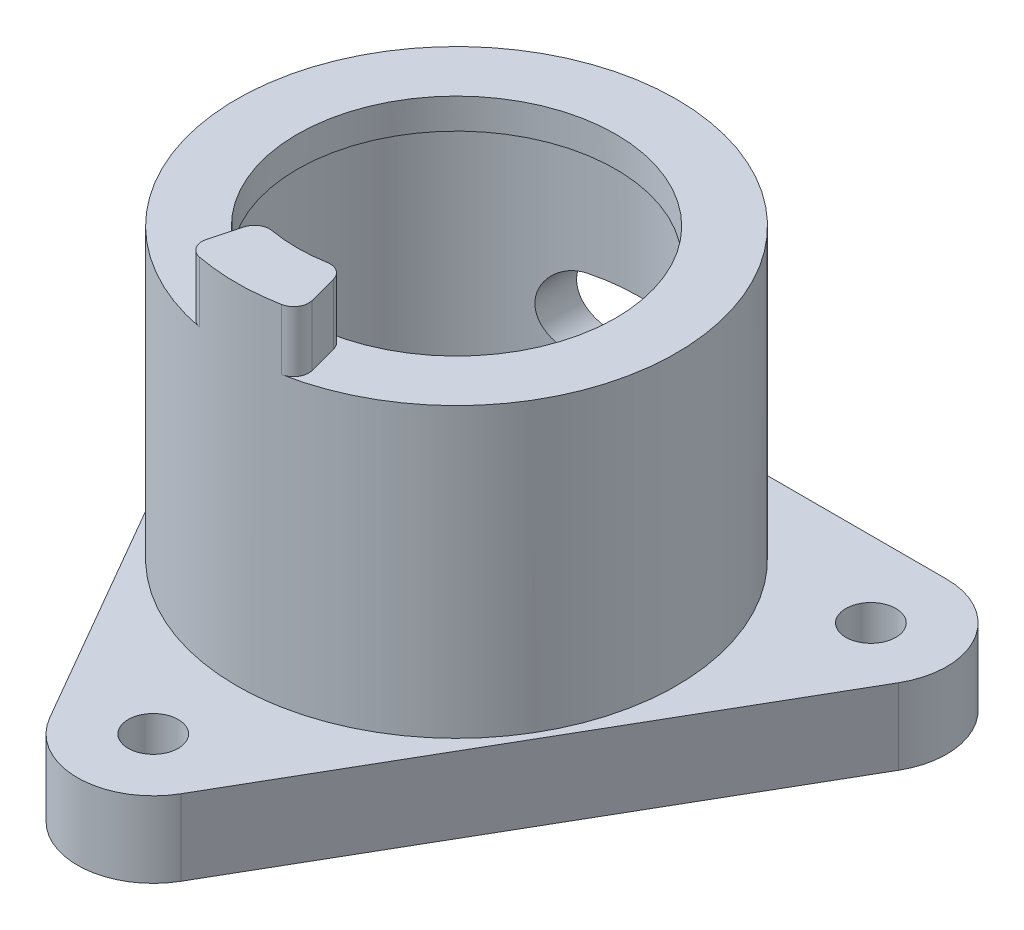
ISO-10303-21;
HEADER;
FILE_DESCRIPTION(('STEP AP214'),'2;1');
FILE_NAME('part.step','',(''),(''),'','','');
FILE_SCHEMA(('AUTOMOTIVE_DESIGN { 1 0 10303 214 1 1 1 1 }'));
ENDSEC;
DATA;
#1=APPLICATION_CONTEXT('core data for automotive mechanical design processes');
#2=APPLICATION_PROTOCOL_DEFINITION('international standard','automotive_design',2000,#1);
#3=PRODUCT_CONTEXT('',#1,'mechanical');
#4=PRODUCT('Part','Part','',(#3));
#5=PRODUCT_RELATED_PRODUCT_CATEGORY('part','',(#4));
#6=PRODUCT_DEFINITION_FORMATION('','',#4);
#7=PRODUCT_DEFINITION_CONTEXT('part definition',#1,'design');
#8=PRODUCT_DEFINITION('design','',#6,#7);
#9=PRODUCT_DEFINITION_SHAPE('','',#8);
#10=(LENGTH_UNIT() NAMED_UNIT(*) SI_UNIT(.MILLI.,.METRE.));
#11=(NAMED_UNIT(*) PLANE_ANGLE_UNIT() SI_UNIT($,.RADIAN.));
#12=(NAMED_UNIT(*) SI_UNIT($,.STERADIAN.) SOLID_ANGLE_UNIT());
#13=UNCERTAINTY_MEASURE_WITH_UNIT(LENGTH_MEASURE(1.E-05),#10,'distance_accuracy_value','');
#14=(GEOMETRIC_REPRESENTATION_CONTEXT(3) GLOBAL_UNCERTAINTY_ASSIGNED_CONTEXT((#13)) GLOBAL_UNIT_ASSIGNED_CONTEXT((#10,
#11,#12)) REPRESENTATION_CONTEXT('',''));
#15=CARTESIAN_POINT('',(0.,0.,0.));
#16=DIRECTION('',(0.,0.,1.));
#17=DIRECTION('',(1.,0.,0.));
#18=AXIS2_PLACEMENT_3D('',#15,#16,#17);
#19=CARTESIAN_POINT('',(17.3205080756888,5.,-9.99999999999998));
#20=DIRECTION('',(0.,1.,0.));
#21=DIRECTION('',(0.,0.,1.));
#22=AXIS2_PLACEMENT_3D('',#19,#20,#21);
#23=PLANE('',#22);
#24=CARTESIAN_POINT('',(0.,5.,20.));
#25=DIRECTION('',(0.,1.,0.));
#26=DIRECTION('',(0.,0.,1.));
#27=AXIS2_PLACEMENT_3D('',#24,#25,#26);
#28=CIRCLE('',#27,1.65);
#29=CARTESIAN_POINT('',(0.,5.,21.65));
#30=VERTEX_POINT('',#29);
#31=EDGE_CURVE('E287',#30,#30,#28,.T.);
#32=ORIENTED_EDGE('',*,*,#31,.F.);
#33=EDGE_LOOP('',(#32));
#34=FACE_BOUND('',#33,.T.);
#35=CARTESIAN_POINT('',(17.3205080756888,5.,-10.));
#36=DIRECTION('',(0.,1.,0.));
#37=DIRECTION('',(0.,0.,1.));
#38=AXIS2_PLACEMENT_3D('',#35,#36,#37);
#39=CIRCLE('',#38,1.65);
#40=CARTESIAN_POINT('',(17.3205080756888,5.,-8.35000000000001));
#41=VERTEX_POINT('',#40);
#42=EDGE_CURVE('E291',#41,#41,#39,.T.);
#43=ORIENTED_EDGE('',*,*,#42,.F.);
#44=EDGE_LOOP('',(#43));
#45=FACE_BOUND('',#44,.T.);
#46=CARTESIAN_POINT('',(-17.3205080756888,5.,-9.99999999999999));
#47=DIRECTION('',(0.,1.,0.));
#48=DIRECTION('',(0.,0.,1.));
#49=AXIS2_PLACEMENT_3D('',#46,#47,#48);
#50=CIRCLE('',#49,1.65);
#51=CARTESIAN_POINT('',(-17.3205080756888,5.,-8.34999999999999));
#52=VERTEX_POINT('',#51);
#53=EDGE_CURVE('E295',#52,#52,#50,.T.);
#54=ORIENTED_EDGE('',*,*,#53,.F.);
#55=EDGE_LOOP('',(#54));
#56=FACE_BOUND('',#55,.T.);
#57=CARTESIAN_POINT('',(17.3205080756888,5.,-9.99999999999998));
#58=DIRECTION('',(0.,1.,0.));
#59=DIRECTION('',(0.,0.,1.));
#60=AXIS2_PLACEMENT_3D('',#57,#58,#59);
#61=CIRCLE('',#60,5.);
#62=CARTESIAN_POINT('',(21.6506350946111,5.,-7.49999999999974));
#63=VERTEX_POINT('',#62);
#64=CARTESIAN_POINT('',(17.3205080756889,5.,-14.9999999999998));
#65=VERTEX_POINT('',#64);
#66=EDGE_CURVE('E299',#63,#65,#61,.T.);
#67=ORIENTED_EDGE('',*,*,#66,.T.);
#68=DIRECTION('',(-1.,0.,0.));
#69=VECTOR('',#68,1.);
#70=CARTESIAN_POINT('',(17.3205080756889,5.,-14.9999999999998));
#71=LINE('',#70,#69);
#72=CARTESIAN_POINT('',(-17.3205080756886,5.,-15.));
#73=VERTEX_POINT('',#72);
#74=EDGE_CURVE('E316',#65,#73,#71,.T.);
#75=ORIENTED_EDGE('',*,*,#74,.T.);
#76=CARTESIAN_POINT('',(-17.3205080756886,5.,-9.99999999999996));
#77=DIRECTION('',(0.,1.,0.));
#78=DIRECTION('',(0.,0.,1.));
#79=AXIS2_PLACEMENT_3D('',#76,#77,#78);
#80=CIRCLE('',#79,5.00000000000007);
#81=CARTESIAN_POINT('',(-21.6506350946109,5.,-7.50000000000001));
#82=VERTEX_POINT('',#81);
#83=EDGE_CURVE('E319',#73,#82,#80,.T.);
#84=ORIENTED_EDGE('',*,*,#83,.T.);
#85=DIRECTION('',(0.499999999999998,0.,0.86602540378444));
#86=VECTOR('',#85,1.);
#87=CARTESIAN_POINT('',(-21.6506350946109,5.,-7.50000000000001));
#88=LINE('',#87,#86);
#89=CARTESIAN_POINT('',(-4.33012701892213,5.,22.4999999999999));
#90=VERTEX_POINT('',#89);
#91=EDGE_CURVE('E321',#82,#90,#88,.T.);
#92=ORIENTED_EDGE('',*,*,#91,.T.);
#93=CARTESIAN_POINT('',(1.28191059012694E-13,5.,19.9999999999999));
#94=DIRECTION('',(0.,1.,0.));
#95=DIRECTION('',(0.,0.,1.));
#96=AXIS2_PLACEMENT_3D('',#93,#94,#95);
#97=CIRCLE('',#96,5.00000000000007);
#98=CARTESIAN_POINT('',(4.33012701892225,5.,22.5));
#99=VERTEX_POINT('',#98);
#100=EDGE_CURVE('E323',#90,#99,#97,.T.);
#101=ORIENTED_EDGE('',*,*,#100,.T.);
#102=DIRECTION('',(0.500000000000004,0.,-0.866025403784436));
#103=VECTOR('',#102,1.);
#104=CARTESIAN_POINT('',(21.6506350946111,5.,-7.49999999999974));
#105=LINE('',#104,#103);
#106=EDGE_CURVE('E325',#99,#63,#105,.T.);
#107=ORIENTED_EDGE('',*,*,#106,.T.);
#108=EDGE_LOOP('',(#67,#75,#84,#92,#101,#107));
#109=FACE_BOUND('',#108,.T.);
#110=CARTESIAN_POINT('',(0.,5.,0.));
#111=DIRECTION('',(0.,1.,0.));
#112=DIRECTION('',(0.,0.,1.));
#113=AXIS2_PLACEMENT_3D('',#110,#111,#112);
#114=CIRCLE('',#113,14.5);
#115=CARTESIAN_POINT('',(0.,5.,14.5));
#116=VERTEX_POINT('',#115);
#117=EDGE_CURVE('E303',#116,#116,#114,.T.);
#118=ORIENTED_EDGE('',*,*,#117,.F.);
#119=EDGE_LOOP('',(#118));
#120=FACE_BOUND('',#119,.T.);
#121=ADVANCED_FACE('F39',(#34,#45,#56,#109,#120),#23,.T.);
#122=CARTESIAN_POINT('',(17.3205080756888,0.,-9.99999999999998));
#123=DIRECTION('',(0.,1.,0.));
#124=DIRECTION('',(0.,0.,1.));
#125=AXIS2_PLACEMENT_3D('',#122,#123,#124);
#126=PLANE('',#125);
#127=CARTESIAN_POINT('',(0.,0.,20.));
#128=DIRECTION('',(0.,1.,0.));
#129=DIRECTION('',(0.,0.,1.));
#130=AXIS2_PLACEMENT_3D('',#127,#128,#129);
#131=CIRCLE('',#130,1.65);
#132=CARTESIAN_POINT('',(0.,0.,21.65));
#133=VERTEX_POINT('',#132);
#134=EDGE_CURVE('E632',#133,#133,#131,.T.);
#135=ORIENTED_EDGE('',*,*,#134,.T.);
#136=EDGE_LOOP('',(#135));
#137=FACE_BOUND('',#136,.T.);
#138=CARTESIAN_POINT('',(17.3205080756888,0.,-10.));
#139=DIRECTION('',(0.,1.,0.));
#140=DIRECTION('',(0.,0.,1.));
#141=AXIS2_PLACEMENT_3D('',#138,#139,#140);
#142=CIRCLE('',#141,1.65);
#143=CARTESIAN_POINT('',(17.3205080756888,0.,-8.35000000000001));
#144=VERTEX_POINT('',#143);
#145=EDGE_CURVE('E628',#144,#144,#142,.T.);
#146=ORIENTED_EDGE('',*,*,#145,.T.);
#147=EDGE_LOOP('',(#146));
#148=FACE_BOUND('',#147,.T.);
#149=CARTESIAN_POINT('',(-17.3205080756888,0.,-9.99999999999999));
#150=DIRECTION('',(0.,1.,0.));
#151=DIRECTION('',(0.,0.,1.));
#152=AXIS2_PLACEMENT_3D('',#149,#150,#151);
#153=CIRCLE('',#152,1.65);
#154=CARTESIAN_POINT('',(-17.3205080756888,0.,-8.34999999999999));
#155=VERTEX_POINT('',#154);
#156=EDGE_CURVE('E180',#155,#155,#153,.T.);
#157=ORIENTED_EDGE('',*,*,#156,.T.);
#158=EDGE_LOOP('',(#157));
#159=FACE_BOUND('',#158,.T.);
#160=CARTESIAN_POINT('',(17.3205080756888,0.,-9.99999999999998));
#161=DIRECTION('',(0.,1.,0.));
#162=DIRECTION('',(0.,0.,1.));
#163=AXIS2_PLACEMENT_3D('',#160,#161,#162);
#164=CIRCLE('',#163,5.);
#165=CARTESIAN_POINT('',(21.6506350946111,0.,-7.49999999999974));
#166=VERTEX_POINT('',#165);
#167=CARTESIAN_POINT('',(17.3205080756889,0.,-14.9999999999998));
#168=VERTEX_POINT('',#167);
#169=EDGE_CURVE('E308',#166,#168,#164,.T.);
#170=ORIENTED_EDGE('',*,*,#169,.F.);
#171=DIRECTION('',(0.500000000000004,0.,-0.866025403784436));
#172=VECTOR('',#171,1.);
#173=CARTESIAN_POINT('',(21.6506350946111,0.,-7.49999999999974));
#174=LINE('',#173,#172);
#175=CARTESIAN_POINT('',(4.33012701892225,0.,22.5));
#176=VERTEX_POINT('',#175);
#177=EDGE_CURVE('E317',#176,#166,#174,.T.);
#178=ORIENTED_EDGE('',*,*,#177,.F.);
#179=CARTESIAN_POINT('',(1.28191059012694E-13,0.,19.9999999999999));
#180=DIRECTION('',(0.,1.,0.));
#181=DIRECTION('',(0.,0.,1.));
#182=AXIS2_PLACEMENT_3D('',#179,#180,#181);
#183=CIRCLE('',#182,5.00000000000007);
#184=CARTESIAN_POINT('',(-4.33012701892213,0.,22.4999999999999));
#185=VERTEX_POINT('',#184);
#186=EDGE_CURVE('E336',#185,#176,#183,.T.);
#187=ORIENTED_EDGE('',*,*,#186,.F.);
#188=DIRECTION('',(0.499999999999998,0.,0.86602540378444));
#189=VECTOR('',#188,1.);
#190=CARTESIAN_POINT('',(-21.6506350946109,0.,-7.50000000000001));
#191=LINE('',#190,#189);
#192=CARTESIAN_POINT('',(-21.6506350946109,0.,-7.50000000000001));
#193=VERTEX_POINT('',#192);
#194=EDGE_CURVE('E334',#193,#185,#191,.T.);
#195=ORIENTED_EDGE('',*,*,#194,.F.);
#196=CARTESIAN_POINT('',(-17.3205080756886,0.,-9.99999999999996));
#197=DIRECTION('',(0.,1.,0.));
#198=DIRECTION('',(0.,0.,1.));
#199=AXIS2_PLACEMENT_3D('',#196,#197,#198);
#200=CIRCLE('',#199,5.00000000000007);
#201=CARTESIAN_POINT('',(-17.3205080756886,0.,-15.));
#202=VERTEX_POINT('',#201);
#203=EDGE_CURVE('E332',#202,#193,#200,.T.);
#204=ORIENTED_EDGE('',*,*,#203,.F.);
#205=DIRECTION('',(-1.,0.,0.));
#206=VECTOR('',#205,1.);
#207=CARTESIAN_POINT('',(17.3205080756889,0.,-14.9999999999998));
#208=LINE('',#207,#206);
#209=EDGE_CURVE('E330',#168,#202,#208,.T.);
#210=ORIENTED_EDGE('',*,*,#209,.F.);
#211=EDGE_LOOP('',(#170,#178,#187,#195,#204,#210));
#212=FACE_BOUND('',#211,.T.);
#213=CARTESIAN_POINT('',(0.,0.,0.));
#214=DIRECTION('',(0.,1.,0.));
#215=DIRECTION('',(0.,0.,1.));
#216=AXIS2_PLACEMENT_3D('',#213,#214,#215);
#217=CIRCLE('',#216,12.);
#218=CARTESIAN_POINT('',(0.,0.,12.));
#219=VERTEX_POINT('',#218);
#220=EDGE_CURVE('E304',#219,#219,#217,.T.);
#221=ORIENTED_EDGE('',*,*,#220,.T.);
#222=EDGE_LOOP('',(#221));
#223=FACE_BOUND('',#222,.T.);
#224=ADVANCED_FACE('F278',(#137,#148,#159,#212,#223),#126,.F.);
#225=CARTESIAN_POINT('',(17.3205080756888,5.,-9.99999999999998));
#226=DIRECTION('',(0.,-1.,0.));
#227=DIRECTION('',(0.,0.,-1.));
#228=AXIS2_PLACEMENT_3D('',#225,#226,#227);
#229=CYLINDRICAL_SURFACE('',#228,5.);
#230=ORIENTED_EDGE('',*,*,#169,.T.);
#231=DIRECTION('',(0.,-1.,0.));
#232=VECTOR('',#231,1.);
#233=CARTESIAN_POINT('',(17.3205080756889,5.,-14.9999999999998));
#234=LINE('',#233,#232);
#235=EDGE_CURVE('E171',#65,#168,#234,.T.);
#236=ORIENTED_EDGE('',*,*,#235,.F.);
#237=ORIENTED_EDGE('',*,*,#66,.F.);
#238=DIRECTION('',(0.,-1.,0.));
#239=VECTOR('',#238,1.);
#240=CARTESIAN_POINT('',(21.6506350946111,5.,-7.49999999999974));
#241=LINE('',#240,#239);
#242=EDGE_CURVE('E327',#63,#166,#241,.T.);
#243=ORIENTED_EDGE('',*,*,#242,.T.);
#244=EDGE_LOOP('',(#230,#236,#237,#243));
#245=FACE_BOUND('',#244,.T.);
#246=ADVANCED_FACE('F41',(#245),#229,.T.);
#247=CARTESIAN_POINT('',(17.3205080756889,5.,-14.9999999999998));
#248=DIRECTION('',(0.,0.,1.));
#249=DIRECTION('',(1.,0.,0.));
#250=AXIS2_PLACEMENT_3D('',#247,#248,#249);
#251=PLANE('',#250);
#252=ORIENTED_EDGE('',*,*,#209,.T.);
#253=DIRECTION('',(0.,-1.,0.));
#254=VECTOR('',#253,1.);
#255=CARTESIAN_POINT('',(-17.3205080756886,5.,-15.));
#256=LINE('',#255,#254);
#257=EDGE_CURVE('E350',#73,#202,#256,.T.);
#258=ORIENTED_EDGE('',*,*,#257,.F.);
#259=ORIENTED_EDGE('',*,*,#74,.F.);
#260=ORIENTED_EDGE('',*,*,#235,.T.);
#261=EDGE_LOOP('',(#252,#258,#259,#260));
#262=FACE_BOUND('',#261,.T.);
#263=ADVANCED_FACE('F668',(#262),#251,.F.);
#264=CARTESIAN_POINT('',(-17.3205080756886,5.,-9.99999999999996));
#265=DIRECTION('',(0.,-1.,0.));
#266=DIRECTION('',(0.,0.,-1.));
#267=AXIS2_PLACEMENT_3D('',#264,#265,#266);
#268=CYLINDRICAL_SURFACE('',#267,5.00000000000007);
#269=ORIENTED_EDGE('',*,*,#203,.T.);
#270=DIRECTION('',(0.,-1.,0.));
#271=VECTOR('',#270,1.);
#272=CARTESIAN_POINT('',(-21.6506350946109,5.,-7.50000000000001));
#273=LINE('',#272,#271);
#274=EDGE_CURVE('E347',#82,#193,#273,.T.);
#275=ORIENTED_EDGE('',*,*,#274,.F.);
#276=ORIENTED_EDGE('',*,*,#83,.F.);
#277=ORIENTED_EDGE('',*,*,#257,.T.);
#278=EDGE_LOOP('',(#269,#275,#276,#277));
#279=FACE_BOUND('',#278,.T.);
#280=ADVANCED_FACE('F665',(#279),#268,.T.);
#281=CARTESIAN_POINT('',(-21.6506350946109,5.,-7.50000000000001));
#282=DIRECTION('',(0.86602540378444,0.,-0.499999999999998));
#283=DIRECTION('',(-0.499999999999998,0.,-0.86602540378444));
#284=AXIS2_PLACEMENT_3D('',#281,#282,#283);
#285=PLANE('',#284);
#286=ORIENTED_EDGE('',*,*,#194,.T.);
#287=DIRECTION('',(0.,-1.,0.));
#288=VECTOR('',#287,1.);
#289=CARTESIAN_POINT('',(-4.33012701892213,5.,22.4999999999999));
#290=LINE('',#289,#288);
#291=EDGE_CURVE('E344',#90,#185,#290,.T.);
#292=ORIENTED_EDGE('',*,*,#291,.F.);
#293=ORIENTED_EDGE('',*,*,#91,.F.);
#294=ORIENTED_EDGE('',*,*,#274,.T.);
#295=EDGE_LOOP('',(#286,#292,#293,#294));
#296=FACE_BOUND('',#295,.T.);
#297=ADVANCED_FACE('F660',(#296),#285,.F.);
#298=CARTESIAN_POINT('',(1.28191059012694E-13,5.,19.9999999999999));
#299=DIRECTION('',(0.,-1.,0.));
#300=DIRECTION('',(0.,0.,-1.));
#301=AXIS2_PLACEMENT_3D('',#298,#299,#300);
#302=CYLINDRICAL_SURFACE('',#301,5.00000000000007);
#303=ORIENTED_EDGE('',*,*,#186,.T.);
#304=DIRECTION('',(0.,-1.,0.));
#305=VECTOR('',#304,1.);
#306=CARTESIAN_POINT('',(4.33012701892225,5.,22.5));
#307=LINE('',#306,#305);
#308=EDGE_CURVE('E341',#99,#176,#307,.T.);
#309=ORIENTED_EDGE('',*,*,#308,.F.);
#310=ORIENTED_EDGE('',*,*,#100,.F.);
#311=ORIENTED_EDGE('',*,*,#291,.T.);
#312=EDGE_LOOP('',(#303,#309,#310,#311));
#313=FACE_BOUND('',#312,.T.);
#314=ADVANCED_FACE('F656',(#313),#302,.T.);
#315=CARTESIAN_POINT('',(21.6506350946111,5.,-7.49999999999974));
#316=DIRECTION('',(-0.866025403784436,0.,-0.500000000000004));
#317=DIRECTION('',(-0.500000000000004,0.,0.866025403784436));
#318=AXIS2_PLACEMENT_3D('',#315,#316,#317);
#319=PLANE('',#318);
#320=ORIENTED_EDGE('',*,*,#177,.T.);
#321=ORIENTED_EDGE('',*,*,#242,.F.);
#322=ORIENTED_EDGE('',*,*,#106,.F.);
#323=ORIENTED_EDGE('',*,*,#308,.T.);
#324=EDGE_LOOP('',(#320,#321,#322,#323));
#325=FACE_BOUND('',#324,.T.);
#326=ADVANCED_FACE('F220',(#325),#319,.F.);
#327=CARTESIAN_POINT('',(0.,5.,0.));
#328=DIRECTION('',(0.,-1.,0.));
#329=DIRECTION('',(0.,0.,-1.));
#330=AXIS2_PLACEMENT_3D('',#327,#328,#329);
#331=CYLINDRICAL_SURFACE('',#330,12.);
#332=CARTESIAN_POINT('',(3.,9.,-11.6189500386223));
#333=CARTESIAN_POINT('',(3.07360403993331,9.00000079930749,-11.5999498202118));
#334=CARTESIAN_POINT('',(3.14698259223645,9.00325186905357,-11.5802524261636));
#335=CARTESIAN_POINT('',(3.29281215672263,9.01612762974181,-11.5396317344697));
#336=CARTESIAN_POINT('',(3.36526345063524,9.02575033555729,-11.5187088204931));
#337=CARTESIAN_POINT('',(3.58021029585404,9.06392294464947,-11.4544466056659));
#338=CARTESIAN_POINT('',(3.7206832993467,9.10177872578611,-11.4095140945153));
#339=CARTESIAN_POINT('',(3.99213362881255,9.20074768448258,-11.317396275077));
#340=CARTESIAN_POINT('',(4.12311827108479,9.26184271047136,-11.2702127500896));
#341=CARTESIAN_POINT('',(4.37272206271164,9.40563134738984,-11.1757378208297));
#342=CARTESIAN_POINT('',(4.49133460073362,9.48833642427486,-11.1284463725388));
#343=CARTESIAN_POINT('',(4.71589611284603,9.6758215282738,-11.0351930454861));
#344=CARTESIAN_POINT('',(4.82145648981427,9.78109968587088,-10.9892935412877));
#345=CARTESIAN_POINT('',(5.01311892285581,10.0101573496807,-10.9031966426444));
#346=CARTESIAN_POINT('',(5.09922463864767,10.1339333688727,-10.8629981762779));
#347=CARTESIAN_POINT('',(5.2454754482452,10.3914713666513,-10.7931138833029));
#348=CARTESIAN_POINT('',(5.3065570245806,10.524597739154,-10.7630581878301));
#349=CARTESIAN_POINT('',(5.40484486161562,10.8012779019921,-10.7140428627232));
#350=CARTESIAN_POINT('',(5.44207498819915,10.9448211085299,-10.695072143082));
#351=CARTESIAN_POINT('',(5.48807086126969,11.2221766618782,-10.6715354706624));
#352=CARTESIAN_POINT('',(5.49938150159003,11.3554607429424,-10.6656830303571));
#353=CARTESIAN_POINT('',(5.50056828992668,11.6221318058033,-10.6650718690428));
#354=CARTESIAN_POINT('',(5.49045135766899,11.7555187404793,-10.6703095666332));
#355=CARTESIAN_POINT('',(5.45055929442183,12.0102968381362,-10.6907365509561));
#356=CARTESIAN_POINT('',(5.42198803168209,12.1319298250695,-10.7053159920034));
#357=CARTESIAN_POINT('',(5.34758914524172,12.3684479792591,-10.7426724322246));
#358=CARTESIAN_POINT('',(5.30175866032801,12.4833320240313,-10.7654507905774));
#359=CARTESIAN_POINT('',(5.19206493929214,12.7088313019123,-10.8187951276433));
#360=CARTESIAN_POINT('',(5.12748606808274,12.8190249752366,-10.849664172107));
#361=CARTESIAN_POINT('',(4.98329070701498,13.0272909446509,-10.9166444952707));
#362=CARTESIAN_POINT('',(4.90366900930938,13.1253590233321,-10.9527575884627));
#363=CARTESIAN_POINT('',(4.72278970810869,13.3168716698407,-11.0320411636807));
#364=CARTESIAN_POINT('',(4.62016783299758,13.4088862424478,-11.0755563322324));
#365=CARTESIAN_POINT('',(4.40163950331997,13.5746649923062,-11.1642051861911));
#366=CARTESIAN_POINT('',(4.28572309177784,13.6484153582054,-11.2093400670724));
#367=CARTESIAN_POINT('',(4.03462077666517,13.7805912130869,-11.3022560615091));
#368=CARTESIAN_POINT('',(3.8986513554195,13.8375594349679,-11.3499979078717));
#369=CARTESIAN_POINT('',(3.61804003288701,13.9268552664426,-11.4425304927735));
#370=CARTESIAN_POINT('',(3.47341308417947,13.9592241089408,-11.4873260541377));
#371=CARTESIAN_POINT('',(3.27258394542251,13.9856942160067,-11.5452755798985));
#372=CARTESIAN_POINT('',(3.2183020656736,13.9910506473935,-11.5605247426741));
#373=CARTESIAN_POINT('',(3.10938868491745,13.9981996768551,-11.5902923011545));
#374=CARTESIAN_POINT('',(3.05475779146001,13.9999973362756,-11.6048117060285));
#375=CARTESIAN_POINT('',(3.00000000000001,14.,-11.6189500386223));
#376=B_SPLINE_CURVE_WITH_KNOTS('',3,(#332,#333,#334,#335,#336,#337,#338,#339,#340,#341,#342,
#343,#344,#345,#346,#347,#348,#349,#350,#351,#352,#353,#354,#355,#356,#357,#358,#359,#360,#361,
#362,#363,#364,#365,#366,#367,#368,#369,#370,#371,#372,#373,#374,#375),.UNSPECIFIED.,.F.,.F.,(4,
2,2,2,2,2,2,2,2,2,2,2,2,2,2,2,2,2,2,2,2,4),(0.,0.227894871360382,0.455718773906632,
0.910190550296794,1.36430807707472,1.81866704252706,2.28433302328946,2.74991133210695,
3.19598438045614,3.64161038579188,4.04116456223921,4.44058972809254,4.81627994271881,
5.19203246625351,5.58461199699046,5.97732768918208,6.40910325516609,6.84120433865265,
7.30394146020145,7.76590123140063,7.93572005436792,8.10529718411948),.UNSPECIFIED.);
#377=CARTESIAN_POINT('',(3.,9.,-11.6189500386223));
#378=VERTEX_POINT('',#377);
#379=CARTESIAN_POINT('',(3.,14.,-11.6189500386223));
#380=VERTEX_POINT('',#379);
#381=EDGE_CURVE('E178',#378,#380,#376,.T.);
#382=ORIENTED_EDGE('',*,*,#381,.F.);
#383=CARTESIAN_POINT('',(0.,9.,0.));
#384=DIRECTION('',(0.,-1.,0.));
#385=DIRECTION('',(0.,0.,-1.));
#386=AXIS2_PLACEMENT_3D('',#383,#384,#385);
#387=CIRCLE('',#386,12.);
#388=CARTESIAN_POINT('',(-3.,9.,-11.6189500386223));
#389=VERTEX_POINT('',#388);
#390=EDGE_CURVE('E213',#389,#378,#387,.T.);
#391=ORIENTED_EDGE('',*,*,#390,.F.);
#392=CARTESIAN_POINT('',(-3.,14.,-11.6189500386223));
#393=CARTESIAN_POINT('',(-3.07360403993331,13.9999992006925,-11.5999498202118));
#394=CARTESIAN_POINT('',(-3.14698259223645,13.9967481309464,-11.5802524261636));
#395=CARTESIAN_POINT('',(-3.29281215672263,13.9838723702582,-11.5396317344697));
#396=CARTESIAN_POINT('',(-3.36526345063524,13.9742496644427,-11.5187088204931));
#397=CARTESIAN_POINT('',(-3.58021029585404,13.9360770553505,-11.4544466056659));
#398=CARTESIAN_POINT('',(-3.7206832993467,13.8982212742139,-11.4095140945153));
#399=CARTESIAN_POINT('',(-3.99213362881255,13.7992523155174,-11.317396275077));
#400=CARTESIAN_POINT('',(-4.12311827108479,13.7381572895286,-11.2702127500896));
#401=CARTESIAN_POINT('',(-4.37272206271164,13.5943686526102,-11.1757378208297));
#402=CARTESIAN_POINT('',(-4.49133460073362,13.5116635757251,-11.1284463725388));
#403=CARTESIAN_POINT('',(-4.71589611284602,13.3241784717262,-11.0351930454861));
#404=CARTESIAN_POINT('',(-4.82145648981427,13.2189003141291,-10.9892935412877));
#405=CARTESIAN_POINT('',(-5.01311892285581,12.9898426503193,-10.9031966426444));
#406=CARTESIAN_POINT('',(-5.09922463864767,12.8660666311273,-10.8629981762779));
#407=CARTESIAN_POINT('',(-5.2454754482452,12.6085286333487,-10.7931138833029));
#408=CARTESIAN_POINT('',(-5.3065570245806,12.475402260846,-10.7630581878301));
#409=CARTESIAN_POINT('',(-5.40484486161562,12.1987220980079,-10.7140428627232));
#410=CARTESIAN_POINT('',(-5.44207498819915,12.0551788914701,-10.695072143082));
#411=CARTESIAN_POINT('',(-5.48807086126969,11.7778233381218,-10.6715354706624));
#412=CARTESIAN_POINT('',(-5.49938150159003,11.6445392570576,-10.6656830303571));
#413=CARTESIAN_POINT('',(-5.50056828992668,11.3778681941967,-10.6650718690428));
#414=CARTESIAN_POINT('',(-5.490451357669,11.2444812595207,-10.6703095666332));
#415=CARTESIAN_POINT('',(-5.45055929442183,10.9897031618638,-10.6907365509561));
#416=CARTESIAN_POINT('',(-5.42198803168209,10.8680701749304,-10.7053159920034));
#417=CARTESIAN_POINT('',(-5.34758914524172,10.6315520207409,-10.7426724322246));
#418=CARTESIAN_POINT('',(-5.30175866032801,10.5166679759687,-10.7654507905774));
#419=CARTESIAN_POINT('',(-5.19206493929214,10.2911686980877,-10.8187951276433));
#420=CARTESIAN_POINT('',(-5.12748606808274,10.1809750247634,-10.849664172107));
#421=CARTESIAN_POINT('',(-4.98329070701498,9.97270905534915,-10.9166444952707));
#422=CARTESIAN_POINT('',(-4.90366900930938,9.87464097666791,-10.9527575884627));
#423=CARTESIAN_POINT('',(-4.72278970810869,9.68312833015926,-11.0320411636807));
#424=CARTESIAN_POINT('',(-4.62016783299759,9.59111375755216,-11.0755563322324));
#425=CARTESIAN_POINT('',(-4.40163950331997,9.42533500769381,-11.1642051861911));
#426=CARTESIAN_POINT('',(-4.28572309177784,9.35158464179456,-11.2093400670724));
#427=CARTESIAN_POINT('',(-4.03462077666517,9.21940878691312,-11.3022560615091));
#428=CARTESIAN_POINT('',(-3.8986513554195,9.16244056503209,-11.3499979078717));
#429=CARTESIAN_POINT('',(-3.61804003288701,9.07314473355745,-11.4425304927735));
#430=CARTESIAN_POINT('',(-3.47341308417947,9.0407758910592,-11.4873260541377));
#431=CARTESIAN_POINT('',(-3.27258394542251,9.01430578399334,-11.5452755798985));
#432=CARTESIAN_POINT('',(-3.2183020656736,9.00894935260651,-11.5605247426741));
#433=CARTESIAN_POINT('',(-3.10938868491745,9.00180032314492,-11.5902923011545));
#434=CARTESIAN_POINT('',(-3.05475779146001,9.00000266372436,-11.6048117060285));
#435=CARTESIAN_POINT('',(-3.00000000000001,8.99999999999996,-11.6189500386223));
#436=B_SPLINE_CURVE_WITH_KNOTS('',3,(#392,#393,#394,#395,#396,#397,#398,#399,#400,#401,#402,
#403,#404,#405,#406,#407,#408,#409,#410,#411,#412,#413,#414,#415,#416,#417,#418,#419,#420,#421,
#422,#423,#424,#425,#426,#427,#428,#429,#430,#431,#432,#433,#434,#435),.UNSPECIFIED.,.F.,.F.,(4,
2,2,2,2,2,2,2,2,2,2,2,2,2,2,2,2,2,2,2,2,4),(0.,0.227894871360381,0.455718773906632,
0.910190550296794,1.36430807707472,1.81866704252706,2.28433302328946,2.74991133210695,
3.19598438045614,3.64161038579188,4.04116456223921,4.44058972809255,4.81627994271881,
5.19203246625351,5.58461199699046,5.97732768918208,6.40910325516609,6.84120433865265,
7.30394146020145,7.76590123140063,7.93572005436792,8.10529718411948),.UNSPECIFIED.);
#437=CARTESIAN_POINT('',(-3.,14.,-11.6189500386223));
#438=VERTEX_POINT('',#437);
#439=EDGE_CURVE('E207',#438,#389,#436,.T.);
#440=ORIENTED_EDGE('',*,*,#439,.F.);
#441=CARTESIAN_POINT('',(0.,14.,0.));
#442=DIRECTION('',(0.,1.,0.));
#443=DIRECTION('',(-1.,0.,0.));
#444=AXIS2_PLACEMENT_3D('',#441,#442,#443);
#445=CIRCLE('',#444,12.);
#446=EDGE_CURVE('E214',#380,#438,#445,.T.);
#447=ORIENTED_EDGE('',*,*,#446,.F.);
#448=EDGE_LOOP('',(#382,#391,#440,#447));
#449=FACE_BOUND('',#448,.T.);
#450=ORIENTED_EDGE('',*,*,#220,.F.);
#451=EDGE_LOOP('',(#450));
#452=FACE_BOUND('',#451,.T.);
#453=CARTESIAN_POINT('',(0.,22.,0.));
#454=DIRECTION('',(0.,1.,0.));
#455=DIRECTION('',(0.,0.,1.));
#456=AXIS2_PLACEMENT_3D('',#453,#454,#455);
#457=CIRCLE('',#456,12.);
#458=CARTESIAN_POINT('',(0.,22.,12.));
#459=VERTEX_POINT('',#458);
#460=EDGE_CURVE('E305',#459,#459,#457,.T.);
#461=ORIENTED_EDGE('',*,*,#460,.T.);
#462=EDGE_LOOP('',(#461));
#463=FACE_BOUND('',#462,.T.);
#464=ADVANCED_FACE('F216',(#449,#452,#463),#331,.F.);
#465=CARTESIAN_POINT('',(0.,22.,0.));
#466=DIRECTION('',(0.,-1.,0.));
#467=DIRECTION('',(0.,0.,-1.));
#468=AXIS2_PLACEMENT_3D('',#465,#466,#467);
#469=CYLINDRICAL_SURFACE('',#468,14.5);
#470=CARTESIAN_POINT('',(0.,9.,0.));
#471=DIRECTION('',(0.,-1.,0.));
#472=DIRECTION('',(0.,0.,-1.));
#473=AXIS2_PLACEMENT_3D('',#470,#471,#472);
#474=CIRCLE('',#473,14.5);
#475=CARTESIAN_POINT('',(-3.,9.,-14.1862609591111));
#476=VERTEX_POINT('',#475);
#477=CARTESIAN_POINT('',(3.,9.,-14.1862609591111));
#478=VERTEX_POINT('',#477);
#479=EDGE_CURVE('E52',#476,#478,#474,.T.);
#480=ORIENTED_EDGE('',*,*,#479,.T.);
#481=CARTESIAN_POINT('',(3.,9.,-14.1862609591111));
#482=CARTESIAN_POINT('',(3.07255300733215,9.00000067808193,-14.1709213178012));
#483=CARTESIAN_POINT('',(3.14494727142017,9.00315988974901,-14.155026474463));
#484=CARTESIAN_POINT('',(3.28895518561032,9.01570282483575,-14.1222594486905));
#485=CARTESIAN_POINT('',(3.3605690050599,9.02508516942697,-14.1053874835079));
#486=CARTESIAN_POINT('',(3.57328230308738,9.06237567705552,-14.0535706570102));
#487=CARTESIAN_POINT('',(3.71257558305128,9.09942818094748,-14.017356475896));
#488=CARTESIAN_POINT('',(3.98221502153945,9.19656450771915,-13.9431549198382));
#489=CARTESIAN_POINT('',(4.1125643810011,9.25664003966675,-13.9051681875362));
#490=CARTESIAN_POINT('',(4.3611643279154,9.39817109482,-13.829213395508));
#491=CARTESIAN_POINT('',(4.47941175627485,9.47963218083541,-13.7912453432192));
#492=CARTESIAN_POINT('',(4.70234395014195,9.66336956301852,-13.7168510285192));
#493=CARTESIAN_POINT('',(4.80679226764464,9.76594660391235,-13.6804574416114));
#494=CARTESIAN_POINT('',(4.99680819820384,9.98865303582015,-13.6122049038284));
#495=CARTESIAN_POINT('',(5.08237743867979,10.1087809124271,-13.580345562175));
#496=CARTESIAN_POINT('',(5.22948181965261,10.3598385207325,-13.524369198187));
#497=CARTESIAN_POINT('',(5.29163227262329,10.4903629691827,-13.5000574456885));
#498=CARTESIAN_POINT('',(5.39274482809298,10.7613203510544,-13.4599886603588));
#499=CARTESIAN_POINT('',(5.43172051172273,10.901747427145,-13.4442266176098));
#500=CARTESIAN_POINT('',(5.48292028606153,11.178251568264,-13.4234234448533));
#501=CARTESIAN_POINT('',(5.49677958760404,11.313977620264,-13.4177276455115));
#502=CARTESIAN_POINT('',(5.50221858615802,11.5859360919733,-13.4154987570248));
#503=CARTESIAN_POINT('',(5.49380383867102,11.7221683769565,-13.4189633831242));
#504=CARTESIAN_POINT('',(5.45588209284762,11.9853901990795,-13.4344233778511));
#505=CARTESIAN_POINT('',(5.42725575294512,12.1125295283193,-13.4460624615141));
#506=CARTESIAN_POINT('',(5.35098236881651,12.3600330180664,-13.4765968242365));
#507=CARTESIAN_POINT('',(5.30333325588597,12.4803964400768,-13.4954928924761));
#508=CARTESIAN_POINT('',(5.18910920530113,12.714591703798,-13.5398294263759));
#509=CARTESIAN_POINT('',(5.12205863102748,12.828159945283,-13.5654326045897));
#510=CARTESIAN_POINT('',(4.97165627246994,13.0426410395962,-13.6212722242525));
#511=CARTESIAN_POINT('',(4.88830048699605,13.1435507761156,-13.6515098025575));
#512=CARTESIAN_POINT('',(4.70149648691503,13.3368846460447,-13.7170091786835));
#513=CARTESIAN_POINT('',(4.59708664774099,13.4283124656627,-13.7524707030452));
#514=CARTESIAN_POINT('',(4.37487697382523,13.5925620961874,-13.8247639075252));
#515=CARTESIAN_POINT('',(4.25706900384227,13.6653725146656,-13.861596410863));
#516=CARTESIAN_POINT('',(4.00507290609595,13.7936361275421,-13.9365518706904));
#517=CARTESIAN_POINT('',(3.87037116261132,13.8480941574028,-13.9746524343174));
#518=CARTESIAN_POINT('',(3.59310399807477,13.9329350874148,-14.04849048039));
#519=CARTESIAN_POINT('',(3.45055161766058,13.9633566965248,-14.0842316769934));
#520=CARTESIAN_POINT('',(3.25546847354823,13.9874404538411,-14.1299211669925));
#521=CARTESIAN_POINT('',(3.20452807797586,13.9921467046481,-14.1415610721209));
#522=CARTESIAN_POINT('',(3.10241893444209,13.9984227576519,-14.1643114531769));
#523=CARTESIAN_POINT('',(3.05125065435421,13.9999973414863,-14.1754227109165));
#524=CARTESIAN_POINT('',(3.,14.,-14.1862609591111));
#525=B_SPLINE_CURVE_WITH_KNOTS('',3,(#481,#482,#483,#484,#485,#486,#487,#488,#489,#490,#491,
#492,#493,#494,#495,#496,#497,#498,#499,#500,#501,#502,#503,#504,#505,#506,#507,#508,#509,#510,
#511,#512,#513,#514,#515,#516,#517,#518,#519,#520,#521,#522,#523,#524),.UNSPECIFIED.,.F.,.F.,(4,
2,2,2,2,2,2,2,2,2,2,2,2,2,2,2,2,2,2,2,2,4),(0.,0.222323876585877,0.444598510429628,
0.888173164246795,1.33158823015954,1.77511875166918,2.22546776787579,2.67577794779048,
3.11325794885261,3.5504813197874,3.9580483620352,4.36551376016978,4.75624069815269,
5.14701013881499,5.5483154341636,5.94971933097433,6.37755511689033,6.80565208247497,
7.25419674935279,7.7020175859631,7.85933854241343,8.01641910578266),.UNSPECIFIED.);
#526=CARTESIAN_POINT('',(3.,14.,-14.1862609591111));
#527=VERTEX_POINT('',#526);
#528=EDGE_CURVE('E11',#478,#527,#525,.T.);
#529=ORIENTED_EDGE('',*,*,#528,.T.);
#530=CARTESIAN_POINT('',(0.,14.,0.));
#531=DIRECTION('',(0.,1.,0.));
#532=DIRECTION('',(-1.,0.,0.));
#533=AXIS2_PLACEMENT_3D('',#530,#531,#532);
#534=CIRCLE('',#533,14.5);
#535=CARTESIAN_POINT('',(-3.,14.,-14.1862609591111));
#536=VERTEX_POINT('',#535);
#537=EDGE_CURVE('E166',#527,#536,#534,.T.);
#538=ORIENTED_EDGE('',*,*,#537,.T.);
#539=CARTESIAN_POINT('',(-3.,14.,-14.1862609591111));
#540=CARTESIAN_POINT('',(-3.07255300733215,13.9999993219181,-14.1709213178012));
#541=CARTESIAN_POINT('',(-3.14494727142017,13.996840110251,-14.155026474463));
#542=CARTESIAN_POINT('',(-3.28895518561032,13.9842971751643,-14.1222594486905));
#543=CARTESIAN_POINT('',(-3.3605690050599,13.974914830573,-14.1053874835079));
#544=CARTESIAN_POINT('',(-3.57328230308738,13.9376243229445,-14.0535706570102));
#545=CARTESIAN_POINT('',(-3.71257558305128,13.9005718190525,-14.017356475896));
#546=CARTESIAN_POINT('',(-3.98221502153945,13.8034354922809,-13.9431549198382));
#547=CARTESIAN_POINT('',(-4.1125643810011,13.7433599603332,-13.9051681875362));
#548=CARTESIAN_POINT('',(-4.3611643279154,13.60182890518,-13.829213395508));
#549=CARTESIAN_POINT('',(-4.47941175627485,13.5203678191646,-13.7912453432192));
#550=CARTESIAN_POINT('',(-4.70234395014195,13.3366304369815,-13.7168510285192));
#551=CARTESIAN_POINT('',(-4.80679226764464,13.2340533960877,-13.6804574416114));
#552=CARTESIAN_POINT('',(-4.99680819820384,13.0113469641799,-13.6122049038284));
#553=CARTESIAN_POINT('',(-5.08237743867979,12.8912190875729,-13.580345562175));
#554=CARTESIAN_POINT('',(-5.22948181965261,12.6401614792675,-13.524369198187));
#555=CARTESIAN_POINT('',(-5.2916322726233,12.5096370308173,-13.5000574456885));
#556=CARTESIAN_POINT('',(-5.39274482809298,12.2386796489456,-13.4599886603588));
#557=CARTESIAN_POINT('',(-5.43172051172274,12.098252572855,-13.4442266176098));
#558=CARTESIAN_POINT('',(-5.48292028606153,11.821748431736,-13.4234234448533));
#559=CARTESIAN_POINT('',(-5.49677958760404,11.686022379736,-13.4177276455115));
#560=CARTESIAN_POINT('',(-5.50221858615802,11.4140639080267,-13.4154987570248));
#561=CARTESIAN_POINT('',(-5.49380383867102,11.2778316230435,-13.4189633831242));
#562=CARTESIAN_POINT('',(-5.45588209284762,11.0146098009205,-13.4344233778511));
#563=CARTESIAN_POINT('',(-5.42725575294512,10.8874704716807,-13.4460624615141));
#564=CARTESIAN_POINT('',(-5.35098236881651,10.6399669819336,-13.4765968242365));
#565=CARTESIAN_POINT('',(-5.30333325588597,10.5196035599232,-13.4954928924761));
#566=CARTESIAN_POINT('',(-5.18910920530113,10.285408296202,-13.5398294263759));
#567=CARTESIAN_POINT('',(-5.12205863102748,10.171840054717,-13.5654326045897));
#568=CARTESIAN_POINT('',(-4.97165627246994,9.95735896040378,-13.6212722242525));
#569=CARTESIAN_POINT('',(-4.88830048699605,9.85644922388436,-13.6515098025575));
#570=CARTESIAN_POINT('',(-4.70149648691504,9.6631153539553,-13.7170091786835));
#571=CARTESIAN_POINT('',(-4.59708664774099,9.57168753433727,-13.7524707030452));
#572=CARTESIAN_POINT('',(-4.37487697382523,9.40743790381258,-13.8247639075252));
#573=CARTESIAN_POINT('',(-4.25706900384227,9.33462748533438,-13.861596410863));
#574=CARTESIAN_POINT('',(-4.00507290609595,9.20636387245789,-13.9365518706904));
#575=CARTESIAN_POINT('',(-3.87037116261132,9.15190584259723,-13.9746524343174));
#576=CARTESIAN_POINT('',(-3.59310399807477,9.06706491258518,-14.04849048039));
#577=CARTESIAN_POINT('',(-3.45055161766058,9.03664330347517,-14.0842316769934));
#578=CARTESIAN_POINT('',(-3.25546847354823,9.01255954615888,-14.1299211669925));
#579=CARTESIAN_POINT('',(-3.20452807797586,9.00785329535194,-14.1415610721209));
#580=CARTESIAN_POINT('',(-3.10241893444209,9.00157724234811,-14.1643114531769));
#581=CARTESIAN_POINT('',(-3.05125065435421,9.00000265851365,-14.1754227109165));
#582=CARTESIAN_POINT('',(-3.,8.99999999999999,-14.1862609591111));
#583=B_SPLINE_CURVE_WITH_KNOTS('',3,(#539,#540,#541,#542,#543,#544,#545,#546,#547,#548,#549,
#550,#551,#552,#553,#554,#555,#556,#557,#558,#559,#560,#561,#562,#563,#564,#565,#566,#567,#568,
#569,#570,#571,#572,#573,#574,#575,#576,#577,#578,#579,#580,#581,#582),.UNSPECIFIED.,.F.,.F.,(4,
2,2,2,2,2,2,2,2,2,2,2,2,2,2,2,2,2,2,2,2,4),(0.,0.222323876585878,0.444598510429628,
0.888173164246796,1.33158823015954,1.77511875166917,2.22546776787579,2.67577794779048,
3.11325794885262,3.5504813197874,3.95804836203521,4.36551376016978,4.75624069815269,
5.14701013881499,5.5483154341636,5.94971933097433,6.37755511689034,6.80565208247497,
7.2541967493528,7.7020175859631,7.85933854241344,8.01641910578266),.UNSPECIFIED.);
#584=EDGE_CURVE('E170',#536,#476,#583,.T.);
#585=ORIENTED_EDGE('',*,*,#584,.T.);
#586=EDGE_LOOP('',(#480,#529,#538,#585));
#587=FACE_BOUND('',#586,.T.);
#588=ORIENTED_EDGE('',*,*,#117,.T.);
#589=EDGE_LOOP('',(#588));
#590=FACE_BOUND('',#589,.T.);
#591=CARTESIAN_POINT('',(0.,24.,0.));
#592=DIRECTION('',(0.,1.,0.));
#593=DIRECTION('',(0.,0.,1.));
#594=AXIS2_PLACEMENT_3D('',#591,#592,#593);
#595=CIRCLE('',#594,14.5);
#596=CARTESIAN_POINT('',(2.70509014768632,24.,14.245437420202));
#597=VERTEX_POINT('',#596);
#598=CARTESIAN_POINT('',(-2.70509014768632,24.,14.245437420202));
#599=VERTEX_POINT('',#598);
#600=EDGE_CURVE('E311',#597,#599,#595,.T.);
#601=ORIENTED_EDGE('',*,*,#600,.F.);
#602=DIRECTION('',(0.,-1.,0.));
#603=VECTOR('',#602,1.);
#604=CARTESIAN_POINT('',(2.70509014768632,28.,14.245437420202));
#605=LINE('',#604,#603);
#606=CARTESIAN_POINT('',(2.70509014768632,28.,14.245437420202));
#607=VERTEX_POINT('',#606);
#608=EDGE_CURVE('E407',#607,#597,#605,.T.);
#609=ORIENTED_EDGE('',*,*,#608,.F.);
#610=CARTESIAN_POINT('',(0.,28.,0.));
#611=DIRECTION('',(0.,1.,0.));
#612=DIRECTION('',(0.,0.,1.));
#613=AXIS2_PLACEMENT_3D('',#610,#611,#612);
#614=CIRCLE('',#613,14.5);
#615=CARTESIAN_POINT('',(-2.70509014768632,28.,14.245437420202));
#616=VERTEX_POINT('',#615);
#617=EDGE_CURVE('E445',#616,#607,#614,.T.);
#618=ORIENTED_EDGE('',*,*,#617,.F.);
#619=DIRECTION('',(0.,-1.,0.));
#620=VECTOR('',#619,1.);
#621=CARTESIAN_POINT('',(-2.70509014768632,28.,14.245437420202));
#622=LINE('',#621,#620);
#623=EDGE_CURVE('E404',#616,#599,#622,.T.);
#624=ORIENTED_EDGE('',*,*,#623,.T.);
#625=EDGE_LOOP('',(#601,#609,#618,#624));
#626=FACE_BOUND('',#625,.T.);
#627=ADVANCED_FACE('F183',(#587,#590,#626),#469,.T.);
#628=CARTESIAN_POINT('',(0.,24.,0.));
#629=DIRECTION('',(0.,1.,0.));
#630=DIRECTION('',(0.,0.,1.));
#631=AXIS2_PLACEMENT_3D('',#628,#629,#630);
#632=PLANE('',#631);
#633=CARTESIAN_POINT('',(1.99921883740717,24.,11.3248895818086));
#634=DIRECTION('',(0.,1.,0.));
#635=DIRECTION('',(0.,0.,1.));
#636=AXIS2_PLACEMENT_3D('',#633,#634,#635);
#637=CIRCLE('',#636,1.);
#638=CARTESIAN_POINT('',(2.96514466369623,24.,11.0660705367061));
#639=VERTEX_POINT('',#638);
#640=CARTESIAN_POINT('',(1.82537372111089,24.,10.3401165746948));
#641=VERTEX_POINT('',#640);
#642=EDGE_CURVE('E228',#639,#641,#637,.T.);
#643=ORIENTED_EDGE('',*,*,#642,.F.);
#644=DIRECTION('',(-0.258819045102521,0.,-0.965925826289068));
#645=VECTOR('',#644,1.);
#646=CARTESIAN_POINT('',(2.96514466369623,24.,11.0660705367061));
#647=LINE('',#646,#645);
#648=CARTESIAN_POINT('',(3.48445803275564,24.,13.0041744150855));
#649=VERTEX_POINT('',#648);
#650=EDGE_CURVE('E396',#649,#639,#647,.T.);
#651=ORIENTED_EDGE('',*,*,#650,.F.);
#652=CARTESIAN_POINT('',(2.51853220646657,24.,13.262993460188));
#653=DIRECTION('',(0.,1.,0.));
#654=DIRECTION('',(0.,0.,1.));
#655=AXIS2_PLACEMENT_3D('',#652,#653,#654);
#656=CIRCLE('',#655,1.);
#657=EDGE_CURVE('E384',#597,#649,#656,.T.);
#658=ORIENTED_EDGE('',*,*,#657,.F.);
#659=ORIENTED_EDGE('',*,*,#600,.T.);
#660=CARTESIAN_POINT('',(-2.51853220646657,24.,13.262993460188));
#661=DIRECTION('',(0.,1.,0.));
#662=DIRECTION('',(0.,0.,-1.));
#663=AXIS2_PLACEMENT_3D('',#660,#661,#662);
#664=CIRCLE('',#663,1.);
#665=CARTESIAN_POINT('',(-3.48445803275564,24.,13.0041744150855));
#666=VERTEX_POINT('',#665);
#667=EDGE_CURVE('E393',#666,#599,#664,.T.);
#668=ORIENTED_EDGE('',*,*,#667,.F.);
#669=DIRECTION('',(-0.258819045102521,0.,0.965925826289068));
#670=VECTOR('',#669,1.);
#671=CARTESIAN_POINT('',(-2.96514466369623,24.,11.0660705367061));
#672=LINE('',#671,#670);
#673=CARTESIAN_POINT('',(-2.96514466369623,24.,11.0660705367061));
#674=VERTEX_POINT('',#673);
#675=EDGE_CURVE('E367',#674,#666,#672,.T.);
#676=ORIENTED_EDGE('',*,*,#675,.F.);
#677=CARTESIAN_POINT('',(-1.99921883740717,24.,11.3248895818086));
#678=DIRECTION('',(0.,1.,0.));
#679=DIRECTION('',(0.,0.,-1.));
#680=AXIS2_PLACEMENT_3D('',#677,#678,#679);
#681=CIRCLE('',#680,1.);
#682=CARTESIAN_POINT('',(-1.82537372111089,24.,10.3401165746948));
#683=VERTEX_POINT('',#682);
#684=EDGE_CURVE('E364',#683,#674,#681,.T.);
#685=ORIENTED_EDGE('',*,*,#684,.F.);
#686=CARTESIAN_POINT('',(0.,24.,0.));
#687=DIRECTION('',(0.,1.,0.));
#688=DIRECTION('',(0.,0.,1.));
#689=AXIS2_PLACEMENT_3D('',#686,#687,#688);
#690=CIRCLE('',#689,10.5);
#691=EDGE_CURVE('E356',#641,#683,#690,.T.);
#692=ORIENTED_EDGE('',*,*,#691,.F.);
#693=EDGE_LOOP('',(#643,#651,#658,#659,#668,#676,#685,#692));
#694=FACE_BOUND('',#693,.T.);
#695=ADVANCED_FACE('F268',(#694),#632,.T.);
#696=CARTESIAN_POINT('',(0.,22.,0.));
#697=DIRECTION('',(0.,1.,0.));
#698=DIRECTION('',(0.,0.,1.));
#699=AXIS2_PLACEMENT_3D('',#696,#697,#698);
#700=PLANE('',#699);
#701=ORIENTED_EDGE('',*,*,#460,.F.);
#702=EDGE_LOOP('',(#701));
#703=FACE_BOUND('',#702,.T.);
#704=CARTESIAN_POINT('',(0.,22.,0.));
#705=DIRECTION('',(0.,1.,0.));
#706=DIRECTION('',(0.,0.,1.));
#707=AXIS2_PLACEMENT_3D('',#704,#705,#706);
#708=CIRCLE('',#707,10.5);
#709=CARTESIAN_POINT('',(0.,22.,10.5));
#710=VERTEX_POINT('',#709);
#711=EDGE_CURVE('E361',#710,#710,#708,.T.);
#712=ORIENTED_EDGE('',*,*,#711,.T.);
#713=EDGE_LOOP('',(#712));
#714=FACE_BOUND('',#713,.T.);
#715=ADVANCED_FACE('F266',(#703,#714),#700,.F.);
#716=CARTESIAN_POINT('',(0.,24.,0.));
#717=DIRECTION('',(0.,-1.,0.));
#718=DIRECTION('',(0.,0.,-1.));
#719=AXIS2_PLACEMENT_3D('',#716,#717,#718);
#720=CYLINDRICAL_SURFACE('',#719,10.5);
#721=ORIENTED_EDGE('',*,*,#691,.T.);
#722=DIRECTION('',(0.,-1.,0.));
#723=VECTOR('',#722,1.);
#724=CARTESIAN_POINT('',(-1.82537372111089,28.,10.3401165746948));
#725=LINE('',#724,#723);
#726=CARTESIAN_POINT('',(-1.82537372111089,28.,10.3401165746948));
#727=VERTEX_POINT('',#726);
#728=EDGE_CURVE('E370',#727,#683,#725,.T.);
#729=ORIENTED_EDGE('',*,*,#728,.F.);
#730=CARTESIAN_POINT('',(0.,28.,0.));
#731=DIRECTION('',(0.,-1.,0.));
#732=DIRECTION('',(0.,0.,1.));
#733=AXIS2_PLACEMENT_3D('',#730,#731,#732);
#734=CIRCLE('',#733,10.5);
#735=CARTESIAN_POINT('',(1.82537372111089,28.,10.3401165746948));
#736=VERTEX_POINT('',#735);
#737=EDGE_CURVE('E441',#736,#727,#734,.T.);
#738=ORIENTED_EDGE('',*,*,#737,.F.);
#739=DIRECTION('',(0.,-1.,0.));
#740=VECTOR('',#739,1.);
#741=CARTESIAN_POINT('',(1.82537372111089,28.,10.3401165746948));
#742=LINE('',#741,#740);
#743=EDGE_CURVE('E373',#736,#641,#742,.T.);
#744=ORIENTED_EDGE('',*,*,#743,.T.);
#745=EDGE_LOOP('',(#721,#729,#738,#744));
#746=FACE_BOUND('',#745,.T.);
#747=ORIENTED_EDGE('',*,*,#711,.F.);
#748=EDGE_LOOP('',(#747));
#749=FACE_BOUND('',#748,.T.);
#750=ADVANCED_FACE('F262',(#746,#749),#720,.F.);
#751=CARTESIAN_POINT('',(1.99921883740717,28.,11.3248895818086));
#752=DIRECTION('',(0.,-1.,0.));
#753=DIRECTION('',(0.,0.,-1.));
#754=AXIS2_PLACEMENT_3D('',#751,#752,#753);
#755=CYLINDRICAL_SURFACE('',#754,1.);
#756=ORIENTED_EDGE('',*,*,#642,.T.);
#757=ORIENTED_EDGE('',*,*,#743,.F.);
#758=CARTESIAN_POINT('',(1.99921883740717,28.,11.3248895818086));
#759=DIRECTION('',(0.,1.,0.));
#760=DIRECTION('',(0.,0.,1.));
#761=AXIS2_PLACEMENT_3D('',#758,#759,#760);
#762=CIRCLE('',#761,1.);
#763=CARTESIAN_POINT('',(2.96514466369623,28.,11.0660705367061));
#764=VERTEX_POINT('',#763);
#765=EDGE_CURVE('E229',#764,#736,#762,.T.);
#766=ORIENTED_EDGE('',*,*,#765,.F.);
#767=DIRECTION('',(0.,-1.,0.));
#768=VECTOR('',#767,1.);
#769=CARTESIAN_POINT('',(2.96514466369623,28.,11.0660705367061));
#770=LINE('',#769,#768);
#771=EDGE_CURVE('E421',#764,#639,#770,.T.);
#772=ORIENTED_EDGE('',*,*,#771,.T.);
#773=EDGE_LOOP('',(#756,#757,#766,#772));
#774=FACE_BOUND('',#773,.T.);
#775=ADVANCED_FACE('F258',(#774),#755,.T.);
#776=CARTESIAN_POINT('',(-1.99921883740717,28.,11.3248895818086));
#777=DIRECTION('',(0.,-1.,0.));
#778=DIRECTION('',(0.,0.,-1.));
#779=AXIS2_PLACEMENT_3D('',#776,#777,#778);
#780=CYLINDRICAL_SURFACE('',#779,1.);
#781=ORIENTED_EDGE('',*,*,#684,.T.);
#782=DIRECTION('',(0.,-1.,0.));
#783=VECTOR('',#782,1.);
#784=CARTESIAN_POINT('',(-2.96514466369623,28.,11.0660705367061));
#785=LINE('',#784,#783);
#786=CARTESIAN_POINT('',(-2.96514466369623,28.,11.0660705367061));
#787=VERTEX_POINT('',#786);
#788=EDGE_CURVE('E374',#787,#674,#785,.T.);
#789=ORIENTED_EDGE('',*,*,#788,.F.);
#790=CARTESIAN_POINT('',(-1.99921883740717,28.,11.3248895818086));
#791=DIRECTION('',(0.,1.,0.));
#792=DIRECTION('',(0.,0.,-1.));
#793=AXIS2_PLACEMENT_3D('',#790,#791,#792);
#794=CIRCLE('',#793,1.);
#795=EDGE_CURVE('E438',#727,#787,#794,.T.);
#796=ORIENTED_EDGE('',*,*,#795,.F.);
#797=ORIENTED_EDGE('',*,*,#728,.T.);
#798=EDGE_LOOP('',(#781,#789,#796,#797));
#799=FACE_BOUND('',#798,.T.);
#800=ADVANCED_FACE('F254',(#799),#780,.T.);
#801=CARTESIAN_POINT('',(-2.96514466369623,28.,11.0660705367061));
#802=DIRECTION('',(0.965925826289068,0.,0.258819045102521));
#803=DIRECTION('',(0.258819045102521,0.,-0.965925826289068));
#804=AXIS2_PLACEMENT_3D('',#801,#802,#803);
#805=PLANE('',#804);
#806=ORIENTED_EDGE('',*,*,#675,.T.);
#807=DIRECTION('',(0.,-1.,0.));
#808=VECTOR('',#807,1.);
#809=CARTESIAN_POINT('',(-3.48445803275564,28.,13.0041744150855));
#810=LINE('',#809,#808);
#811=CARTESIAN_POINT('',(-3.48445803275564,28.,13.0041744150855));
#812=VERTEX_POINT('',#811);
#813=EDGE_CURVE('E406',#812,#666,#810,.T.);
#814=ORIENTED_EDGE('',*,*,#813,.F.);
#815=DIRECTION('',(-0.258819045102521,0.,0.965925826289068));
#816=VECTOR('',#815,1.);
#817=CARTESIAN_POINT('',(-2.96514466369623,28.,11.0660705367061));
#818=LINE('',#817,#816);
#819=EDGE_CURVE('E436',#787,#812,#818,.T.);
#820=ORIENTED_EDGE('',*,*,#819,.F.);
#821=ORIENTED_EDGE('',*,*,#788,.T.);
#822=EDGE_LOOP('',(#806,#814,#820,#821));
#823=FACE_BOUND('',#822,.T.);
#824=ADVANCED_FACE('F250',(#823),#805,.F.);
#825=CARTESIAN_POINT('',(-2.51853220646657,28.,13.262993460188));
#826=DIRECTION('',(0.,-1.,0.));
#827=DIRECTION('',(0.,0.,-1.));
#828=AXIS2_PLACEMENT_3D('',#825,#826,#827);
#829=CYLINDRICAL_SURFACE('',#828,1.);
#830=ORIENTED_EDGE('',*,*,#667,.T.);
#831=ORIENTED_EDGE('',*,*,#623,.F.);
#832=CARTESIAN_POINT('',(-2.51853220646657,28.,13.262993460188));
#833=DIRECTION('',(0.,1.,0.));
#834=DIRECTION('',(0.,0.,-1.));
#835=AXIS2_PLACEMENT_3D('',#832,#833,#834);
#836=CIRCLE('',#835,1.);
#837=EDGE_CURVE('E447',#812,#616,#836,.T.);
#838=ORIENTED_EDGE('',*,*,#837,.F.);
#839=ORIENTED_EDGE('',*,*,#813,.T.);
#840=EDGE_LOOP('',(#830,#831,#838,#839));
#841=FACE_BOUND('',#840,.T.);
#842=ADVANCED_FACE('F246',(#841),#829,.T.);
#843=CARTESIAN_POINT('',(2.51853220646657,28.,13.262993460188));
#844=DIRECTION('',(0.,-1.,0.));
#845=DIRECTION('',(0.,0.,-1.));
#846=AXIS2_PLACEMENT_3D('',#843,#844,#845);
#847=CYLINDRICAL_SURFACE('',#846,1.);
#848=ORIENTED_EDGE('',*,*,#657,.T.);
#849=DIRECTION('',(0.,-1.,0.));
#850=VECTOR('',#849,1.);
#851=CARTESIAN_POINT('',(3.48445803275564,28.,13.0041744150855));
#852=LINE('',#851,#850);
#853=CARTESIAN_POINT('',(3.48445803275564,28.,13.0041744150855));
#854=VERTEX_POINT('',#853);
#855=EDGE_CURVE('E416',#854,#649,#852,.T.);
#856=ORIENTED_EDGE('',*,*,#855,.F.);
#857=CARTESIAN_POINT('',(2.51853220646657,28.,13.262993460188));
#858=DIRECTION('',(0.,1.,0.));
#859=DIRECTION('',(0.,0.,1.));
#860=AXIS2_PLACEMENT_3D('',#857,#858,#859);
#861=CIRCLE('',#860,1.);
#862=EDGE_CURVE('E446',#607,#854,#861,.T.);
#863=ORIENTED_EDGE('',*,*,#862,.F.);
#864=ORIENTED_EDGE('',*,*,#608,.T.);
#865=EDGE_LOOP('',(#848,#856,#863,#864));
#866=FACE_BOUND('',#865,.T.);
#867=ADVANCED_FACE('F242',(#866),#847,.T.);
#868=CARTESIAN_POINT('',(2.96514466369623,28.,11.0660705367061));
#869=DIRECTION('',(-0.965925826289068,0.,0.258819045102521));
#870=DIRECTION('',(0.258819045102521,0.,0.965925826289068));
#871=AXIS2_PLACEMENT_3D('',#868,#869,#870);
#872=PLANE('',#871);
#873=ORIENTED_EDGE('',*,*,#650,.T.);
#874=ORIENTED_EDGE('',*,*,#771,.F.);
#875=DIRECTION('',(-0.258819045102521,0.,-0.965925826289068));
#876=VECTOR('',#875,1.);
#877=CARTESIAN_POINT('',(2.96514466369623,28.,11.0660705367061));
#878=LINE('',#877,#876);
#879=EDGE_CURVE('E389',#854,#764,#878,.T.);
#880=ORIENTED_EDGE('',*,*,#879,.F.);
#881=ORIENTED_EDGE('',*,*,#855,.T.);
#882=EDGE_LOOP('',(#873,#874,#880,#881));
#883=FACE_BOUND('',#882,.T.);
#884=ADVANCED_FACE('F238',(#883),#872,.F.);
#885=CARTESIAN_POINT('',(1.99921883740717,28.,11.3248895818086));
#886=DIRECTION('',(0.,1.,0.));
#887=DIRECTION('',(0.,0.,1.));
#888=AXIS2_PLACEMENT_3D('',#885,#886,#887);
#889=PLANE('',#888);
#890=ORIENTED_EDGE('',*,*,#765,.T.);
#891=ORIENTED_EDGE('',*,*,#737,.T.);
#892=ORIENTED_EDGE('',*,*,#795,.T.);
#893=ORIENTED_EDGE('',*,*,#819,.T.);
#894=ORIENTED_EDGE('',*,*,#837,.T.);
#895=ORIENTED_EDGE('',*,*,#617,.T.);
#896=ORIENTED_EDGE('',*,*,#862,.T.);
#897=ORIENTED_EDGE('',*,*,#879,.T.);
#898=EDGE_LOOP('',(#890,#891,#892,#893,#894,#895,#896,#897));
#899=FACE_BOUND('',#898,.T.);
#900=ADVANCED_FACE('F234',(#899),#889,.T.);
#901=CARTESIAN_POINT('',(3.,11.5,-15.));
#902=DIRECTION('',(0.,0.,1.));
#903=DIRECTION('',(1.,0.,0.));
#904=AXIS2_PLACEMENT_3D('',#901,#902,#903);
#905=CYLINDRICAL_SURFACE('',#904,2.5);
#906=ORIENTED_EDGE('',*,*,#381,.T.);
#907=DIRECTION('',(0.,0.,1.));
#908=VECTOR('',#907,1.);
#909=CARTESIAN_POINT('',(3.,14.,-15.));
#910=LINE('',#909,#908);
#911=EDGE_CURVE('E59',#527,#380,#910,.T.);
#912=ORIENTED_EDGE('',*,*,#911,.F.);
#913=ORIENTED_EDGE('',*,*,#528,.F.);
#914=DIRECTION('',(0.,0.,1.));
#915=VECTOR('',#914,1.);
#916=CARTESIAN_POINT('',(3.,9.,-15.));
#917=LINE('',#916,#915);
#918=EDGE_CURVE('E617',#478,#378,#917,.T.);
#919=ORIENTED_EDGE('',*,*,#918,.T.);
#920=EDGE_LOOP('',(#906,#912,#913,#919));
#921=FACE_BOUND('',#920,.T.);
#922=ADVANCED_FACE('F174',(#921),#905,.F.);
#923=CARTESIAN_POINT('',(3.,9.,-15.));
#924=DIRECTION('',(0.,-1.,0.));
#925=DIRECTION('',(0.,0.,-1.));
#926=AXIS2_PLACEMENT_3D('',#923,#924,#925);
#927=PLANE('',#926);
#928=ORIENTED_EDGE('',*,*,#390,.T.);
#929=ORIENTED_EDGE('',*,*,#918,.F.);
#930=ORIENTED_EDGE('',*,*,#479,.F.);
#931=DIRECTION('',(0.,0.,1.));
#932=VECTOR('',#931,1.);
#933=CARTESIAN_POINT('',(-3.,9.,-15.));
#934=LINE('',#933,#932);
#935=EDGE_CURVE('E618',#476,#389,#934,.T.);
#936=ORIENTED_EDGE('',*,*,#935,.T.);
#937=EDGE_LOOP('',(#928,#929,#930,#936));
#938=FACE_BOUND('',#937,.T.);
#939=ADVANCED_FACE('F202',(#938),#927,.F.);
#940=CARTESIAN_POINT('',(-3.,11.5,-15.));
#941=DIRECTION('',(0.,0.,1.));
#942=DIRECTION('',(1.,0.,0.));
#943=AXIS2_PLACEMENT_3D('',#940,#941,#942);
#944=CYLINDRICAL_SURFACE('',#943,2.5);
#945=ORIENTED_EDGE('',*,*,#439,.T.);
#946=ORIENTED_EDGE('',*,*,#935,.F.);
#947=ORIENTED_EDGE('',*,*,#584,.F.);
#948=DIRECTION('',(0.,0.,1.));
#949=VECTOR('',#948,1.);
#950=CARTESIAN_POINT('',(-3.,14.,-15.));
#951=LINE('',#950,#949);
#952=EDGE_CURVE('E64',#536,#438,#951,.T.);
#953=ORIENTED_EDGE('',*,*,#952,.T.);
#954=EDGE_LOOP('',(#945,#946,#947,#953));
#955=FACE_BOUND('',#954,.T.);
#956=ADVANCED_FACE('F197',(#955),#944,.F.);
#957=CARTESIAN_POINT('',(-3.,14.,-15.));
#958=DIRECTION('',(0.,1.,0.));
#959=DIRECTION('',(-1.,0.,0.));
#960=AXIS2_PLACEMENT_3D('',#957,#958,#959);
#961=PLANE('',#960);
#962=ORIENTED_EDGE('',*,*,#446,.T.);
#963=ORIENTED_EDGE('',*,*,#952,.F.);
#964=ORIENTED_EDGE('',*,*,#537,.F.);
#965=ORIENTED_EDGE('',*,*,#911,.T.);
#966=EDGE_LOOP('',(#962,#963,#964,#965));
#967=FACE_BOUND('',#966,.T.);
#968=ADVANCED_FACE('F167',(#967),#961,.F.);
#969=CARTESIAN_POINT('',(-17.3205080756888,5.,-9.99999999999999));
#970=DIRECTION('',(0.,1.,0.));
#971=DIRECTION('',(0.,0.,1.));
#972=AXIS2_PLACEMENT_3D('',#969,#970,#971);
#973=CYLINDRICAL_SURFACE('',#972,1.65);
#974=ORIENTED_EDGE('',*,*,#156,.F.);
#975=EDGE_LOOP('',(#974));
#976=FACE_BOUND('',#975,.T.);
#977=ORIENTED_EDGE('',*,*,#53,.T.);
#978=EDGE_LOOP('',(#977));
#979=FACE_BOUND('',#978,.T.);
#980=ADVANCED_FACE('F563',(#976,#979),#973,.F.);
#981=CARTESIAN_POINT('',(17.3205080756888,5.,-10.));
#982=DIRECTION('',(0.,1.,0.));
#983=DIRECTION('',(0.,0.,1.));
#984=AXIS2_PLACEMENT_3D('',#981,#982,#983);
#985=CYLINDRICAL_SURFACE('',#984,1.65);
#986=ORIENTED_EDGE('',*,*,#145,.F.);
#987=EDGE_LOOP('',(#986));
#988=FACE_BOUND('',#987,.T.);
#989=ORIENTED_EDGE('',*,*,#42,.T.);
#990=EDGE_LOOP('',(#989));
#991=FACE_BOUND('',#990,.T.);
#992=ADVANCED_FACE('F569',(#988,#991),#985,.F.);
#993=CARTESIAN_POINT('',(0.,5.,20.));
#994=DIRECTION('',(0.,1.,0.));
#995=DIRECTION('',(0.,0.,1.));
#996=AXIS2_PLACEMENT_3D('',#993,#994,#995);
#997=CYLINDRICAL_SURFACE('',#996,1.65);
#998=ORIENTED_EDGE('',*,*,#134,.F.);
#999=EDGE_LOOP('',(#998));
#1000=FACE_BOUND('',#999,.T.);
#1001=ORIENTED_EDGE('',*,*,#31,.T.);
#1002=EDGE_LOOP('',(#1001));
#1003=FACE_BOUND('',#1002,.T.);
#1004=ADVANCED_FACE('F579',(#1000,#1003),#997,.F.);
#1005=CLOSED_SHELL('',(#121,#224,#246,#263,#280,#297,#314,#326,#464,#627,#695,#715,#750,#775,
#800,#824,#842,#867,#884,#900,#922,#939,#956,#968,#980,#992,#1004));
#1006=MANIFOLD_SOLID_BREP('B2',#1005);
#1007=ADVANCED_BREP_SHAPE_REPRESENTATION('',(#18,#1006),#14);
#1008=SHAPE_DEFINITION_REPRESENTATION(#9,#1007);
ENDSEC;
END-ISO-10303-21;
